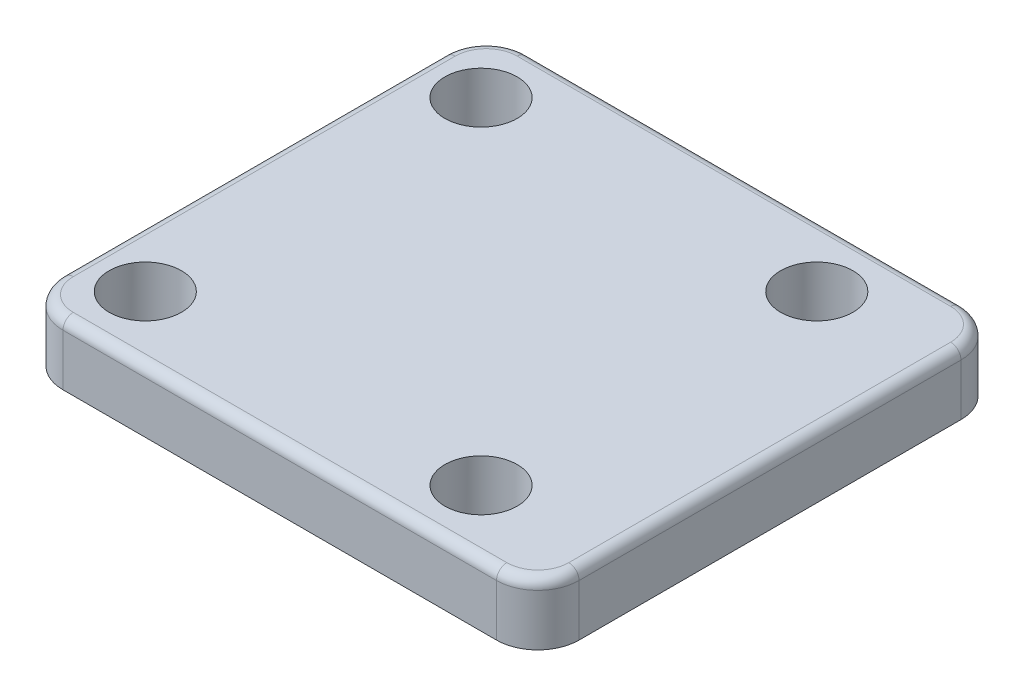
ISO-10303-21;
HEADER;
FILE_DESCRIPTION(('STEP AP214'),'2;1');
FILE_NAME('part.step','',(''),(''),'','','');
FILE_SCHEMA(('AUTOMOTIVE_DESIGN { 1 0 10303 214 1 1 1 1 }'));
ENDSEC;
DATA;
#1=APPLICATION_CONTEXT('core data for automotive mechanical design processes');
#2=APPLICATION_PROTOCOL_DEFINITION('international standard','automotive_design',2000,#1);
#3=PRODUCT_CONTEXT('',#1,'mechanical');
#4=PRODUCT('Part','Part','',(#3));
#5=PRODUCT_RELATED_PRODUCT_CATEGORY('part','',(#4));
#6=PRODUCT_DEFINITION_FORMATION('','',#4);
#7=PRODUCT_DEFINITION_CONTEXT('part definition',#1,'design');
#8=PRODUCT_DEFINITION('design','',#6,#7);
#9=PRODUCT_DEFINITION_SHAPE('','',#8);
#10=(LENGTH_UNIT() NAMED_UNIT(*) SI_UNIT(.MILLI.,.METRE.));
#11=(NAMED_UNIT(*) PLANE_ANGLE_UNIT() SI_UNIT($,.RADIAN.));
#12=(NAMED_UNIT(*) SI_UNIT($,.STERADIAN.) SOLID_ANGLE_UNIT());
#13=UNCERTAINTY_MEASURE_WITH_UNIT(LENGTH_MEASURE(1.E-05),#10,'distance_accuracy_value','');
#14=(GEOMETRIC_REPRESENTATION_CONTEXT(3) GLOBAL_UNCERTAINTY_ASSIGNED_CONTEXT((#13)) GLOBAL_UNIT_ASSIGNED_CONTEXT((#10,
#11,#12)) REPRESENTATION_CONTEXT('',''));
#15=CARTESIAN_POINT('',(0.,0.,0.));
#16=DIRECTION('',(0.,0.,1.));
#17=DIRECTION('',(1.,0.,0.));
#18=AXIS2_PLACEMENT_3D('',#15,#16,#17);
#19=CARTESIAN_POINT('',(24.,6.,-18.5));
#20=DIRECTION('',(0.,-1.,0.));
#21=DIRECTION('',(0.,0.,-1.));
#22=AXIS2_PLACEMENT_3D('',#19,#20,#21);
#23=CYLINDRICAL_SURFACE('',#22,4.);
#24=DIRECTION('',(0.,-1.,0.));
#25=VECTOR('',#24,1.);
#26=CARTESIAN_POINT('',(24.,6.,-22.5));
#27=LINE('',#26,#25);
#28=CARTESIAN_POINT('',(24.,5.,-22.5));
#29=VERTEX_POINT('',#28);
#30=CARTESIAN_POINT('',(24.,0.,-22.5));
#31=VERTEX_POINT('',#30);
#32=EDGE_CURVE('E124',#29,#31,#27,.T.);
#33=ORIENTED_EDGE('',*,*,#32,.F.);
#34=CARTESIAN_POINT('',(24.,5.,-18.5));
#35=DIRECTION('',(0.,-1.,0.));
#36=DIRECTION('',(0.,0.,-1.));
#37=AXIS2_PLACEMENT_3D('',#34,#35,#36);
#38=CIRCLE('',#37,4.);
#39=CARTESIAN_POINT('',(28.,5.,-18.5));
#40=VERTEX_POINT('',#39);
#41=EDGE_CURVE('E212',#29,#40,#38,.T.);
#42=ORIENTED_EDGE('',*,*,#41,.T.);
#43=DIRECTION('',(0.,-1.,0.));
#44=VECTOR('',#43,1.);
#45=CARTESIAN_POINT('',(28.,6.,-18.5));
#46=LINE('',#45,#44);
#47=CARTESIAN_POINT('',(28.,0.,-18.5));
#48=VERTEX_POINT('',#47);
#49=EDGE_CURVE('E145',#40,#48,#46,.T.);
#50=ORIENTED_EDGE('',*,*,#49,.T.);
#51=CARTESIAN_POINT('',(24.,0.,-18.5));
#52=DIRECTION('',(0.,1.,0.));
#53=DIRECTION('',(0.,0.,-1.));
#54=AXIS2_PLACEMENT_3D('',#51,#52,#53);
#55=CIRCLE('',#54,4.);
#56=EDGE_CURVE('E139',#48,#31,#55,.T.);
#57=ORIENTED_EDGE('',*,*,#56,.T.);
#58=EDGE_LOOP('',(#33,#42,#50,#57));
#59=FACE_BOUND('',#58,.T.);
#60=ADVANCED_FACE('F35',(#59),#23,.T.);
#61=CARTESIAN_POINT('',(-18.,6.,-22.5));
#62=DIRECTION('',(0.,0.,1.));
#63=DIRECTION('',(1.,0.,0.));
#64=AXIS2_PLACEMENT_3D('',#61,#62,#63);
#65=PLANE('',#64);
#66=DIRECTION('',(0.,-1.,0.));
#67=VECTOR('',#66,1.);
#68=CARTESIAN_POINT('',(-18.,6.,-22.5));
#69=LINE('',#68,#67);
#70=CARTESIAN_POINT('',(-18.,5.,-22.5));
#71=VERTEX_POINT('',#70);
#72=CARTESIAN_POINT('',(-18.,0.,-22.5));
#73=VERTEX_POINT('',#72);
#74=EDGE_CURVE('E133',#71,#73,#69,.T.);
#75=ORIENTED_EDGE('',*,*,#74,.F.);
#76=DIRECTION('',(-1.,0.,0.));
#77=VECTOR('',#76,1.);
#78=CARTESIAN_POINT('',(-18.,5.,-22.5));
#79=LINE('',#78,#77);
#80=EDGE_CURVE('E51',#71,#29,#79,.F.);
#81=ORIENTED_EDGE('',*,*,#80,.T.);
#82=ORIENTED_EDGE('',*,*,#32,.T.);
#83=DIRECTION('',(-1.,0.,0.));
#84=VECTOR('',#83,1.);
#85=CARTESIAN_POINT('',(-18.,0.,-22.5));
#86=LINE('',#85,#84);
#87=EDGE_CURVE('E127',#31,#73,#86,.T.);
#88=ORIENTED_EDGE('',*,*,#87,.T.);
#89=EDGE_LOOP('',(#75,#81,#82,#88));
#90=FACE_BOUND('',#89,.T.);
#91=ADVANCED_FACE('F126',(#90),#65,.F.);
#92=CARTESIAN_POINT('',(-18.,6.,-18.5));
#93=DIRECTION('',(0.,-1.,0.));
#94=DIRECTION('',(0.,0.,-1.));
#95=AXIS2_PLACEMENT_3D('',#92,#93,#94);
#96=CYLINDRICAL_SURFACE('',#95,4.);
#97=DIRECTION('',(0.,-1.,0.));
#98=VECTOR('',#97,1.);
#99=CARTESIAN_POINT('',(-22.,6.,-18.5));
#100=LINE('',#99,#98);
#101=CARTESIAN_POINT('',(-22.,5.,-18.5));
#102=VERTEX_POINT('',#101);
#103=CARTESIAN_POINT('',(-22.,0.,-18.5));
#104=VERTEX_POINT('',#103);
#105=EDGE_CURVE('E180',#102,#104,#100,.T.);
#106=ORIENTED_EDGE('',*,*,#105,.F.);
#107=CARTESIAN_POINT('',(-18.,5.,-18.5));
#108=DIRECTION('',(0.,-1.,0.));
#109=DIRECTION('',(0.,0.,-1.));
#110=AXIS2_PLACEMENT_3D('',#107,#108,#109);
#111=CIRCLE('',#110,4.);
#112=EDGE_CURVE('E59',#102,#71,#111,.T.);
#113=ORIENTED_EDGE('',*,*,#112,.T.);
#114=ORIENTED_EDGE('',*,*,#74,.T.);
#115=CARTESIAN_POINT('',(-18.,0.,-18.5));
#116=DIRECTION('',(0.,1.,0.));
#117=DIRECTION('',(0.,0.,1.));
#118=AXIS2_PLACEMENT_3D('',#115,#116,#117);
#119=CIRCLE('',#118,4.);
#120=EDGE_CURVE('E142',#73,#104,#119,.T.);
#121=ORIENTED_EDGE('',*,*,#120,.T.);
#122=EDGE_LOOP('',(#106,#113,#114,#121));
#123=FACE_BOUND('',#122,.T.);
#124=ADVANCED_FACE('F274',(#123),#96,.T.);
#125=CARTESIAN_POINT('',(-22.,6.,-18.5));
#126=DIRECTION('',(1.,0.,0.));
#127=DIRECTION('',(0.,0.,-1.));
#128=AXIS2_PLACEMENT_3D('',#125,#126,#127);
#129=PLANE('',#128);
#130=DIRECTION('',(0.,-1.,0.));
#131=VECTOR('',#130,1.);
#132=CARTESIAN_POINT('',(-22.,6.,18.5));
#133=LINE('',#132,#131);
#134=CARTESIAN_POINT('',(-22.,5.,18.5));
#135=VERTEX_POINT('',#134);
#136=CARTESIAN_POINT('',(-22.,0.,18.5));
#137=VERTEX_POINT('',#136);
#138=EDGE_CURVE('E178',#135,#137,#133,.T.);
#139=ORIENTED_EDGE('',*,*,#138,.F.);
#140=DIRECTION('',(0.,0.,1.));
#141=VECTOR('',#140,1.);
#142=CARTESIAN_POINT('',(-22.,5.,-18.5));
#143=LINE('',#142,#141);
#144=EDGE_CURVE('E208',#135,#102,#143,.F.);
#145=ORIENTED_EDGE('',*,*,#144,.T.);
#146=ORIENTED_EDGE('',*,*,#105,.T.);
#147=DIRECTION('',(0.,0.,1.));
#148=VECTOR('',#147,1.);
#149=CARTESIAN_POINT('',(-22.,0.,-18.5));
#150=LINE('',#149,#148);
#151=EDGE_CURVE('E157',#104,#137,#150,.T.);
#152=ORIENTED_EDGE('',*,*,#151,.T.);
#153=EDGE_LOOP('',(#139,#145,#146,#152));
#154=FACE_BOUND('',#153,.T.);
#155=ADVANCED_FACE('F315',(#154),#129,.F.);
#156=CARTESIAN_POINT('',(-18.,6.,18.5));
#157=DIRECTION('',(0.,-1.,0.));
#158=DIRECTION('',(0.,0.,-1.));
#159=AXIS2_PLACEMENT_3D('',#156,#157,#158);
#160=CYLINDRICAL_SURFACE('',#159,4.);
#161=DIRECTION('',(0.,-1.,0.));
#162=VECTOR('',#161,1.);
#163=CARTESIAN_POINT('',(-18.,6.,22.5));
#164=LINE('',#163,#162);
#165=CARTESIAN_POINT('',(-18.,5.,22.5));
#166=VERTEX_POINT('',#165);
#167=CARTESIAN_POINT('',(-18.,0.,22.5));
#168=VERTEX_POINT('',#167);
#169=EDGE_CURVE('E176',#166,#168,#164,.T.);
#170=ORIENTED_EDGE('',*,*,#169,.F.);
#171=CARTESIAN_POINT('',(-18.,5.,18.5));
#172=DIRECTION('',(0.,-1.,0.));
#173=DIRECTION('',(0.,0.,-1.));
#174=AXIS2_PLACEMENT_3D('',#171,#172,#173);
#175=CIRCLE('',#174,4.);
#176=EDGE_CURVE('E206',#166,#135,#175,.T.);
#177=ORIENTED_EDGE('',*,*,#176,.T.);
#178=ORIENTED_EDGE('',*,*,#138,.T.);
#179=CARTESIAN_POINT('',(-18.,0.,18.5));
#180=DIRECTION('',(0.,1.,0.));
#181=DIRECTION('',(0.,0.,1.));
#182=AXIS2_PLACEMENT_3D('',#179,#180,#181);
#183=CIRCLE('',#182,4.);
#184=EDGE_CURVE('E160',#137,#168,#183,.T.);
#185=ORIENTED_EDGE('',*,*,#184,.T.);
#186=EDGE_LOOP('',(#170,#177,#178,#185));
#187=FACE_BOUND('',#186,.T.);
#188=ADVANCED_FACE('F321',(#187),#160,.T.);
#189=CARTESIAN_POINT('',(-18.,6.,22.5));
#190=DIRECTION('',(0.,0.,-1.));
#191=DIRECTION('',(-1.,0.,0.));
#192=AXIS2_PLACEMENT_3D('',#189,#190,#191);
#193=PLANE('',#192);
#194=DIRECTION('',(0.,-1.,0.));
#195=VECTOR('',#194,1.);
#196=CARTESIAN_POINT('',(24.,6.,22.5));
#197=LINE('',#196,#195);
#198=CARTESIAN_POINT('',(24.,5.,22.5));
#199=VERTEX_POINT('',#198);
#200=CARTESIAN_POINT('',(24.,0.,22.5));
#201=VERTEX_POINT('',#200);
#202=EDGE_CURVE('E174',#199,#201,#197,.T.);
#203=ORIENTED_EDGE('',*,*,#202,.F.);
#204=DIRECTION('',(1.,0.,0.));
#205=VECTOR('',#204,1.);
#206=CARTESIAN_POINT('',(-18.,5.,22.5));
#207=LINE('',#206,#205);
#208=EDGE_CURVE('E204',#199,#166,#207,.F.);
#209=ORIENTED_EDGE('',*,*,#208,.T.);
#210=ORIENTED_EDGE('',*,*,#169,.T.);
#211=DIRECTION('',(1.,0.,0.));
#212=VECTOR('',#211,1.);
#213=CARTESIAN_POINT('',(-18.,0.,22.5));
#214=LINE('',#213,#212);
#215=EDGE_CURVE('E163',#168,#201,#214,.T.);
#216=ORIENTED_EDGE('',*,*,#215,.T.);
#217=EDGE_LOOP('',(#203,#209,#210,#216));
#218=FACE_BOUND('',#217,.T.);
#219=ADVANCED_FACE('F324',(#218),#193,.F.);
#220=CARTESIAN_POINT('',(24.,6.,18.5));
#221=DIRECTION('',(0.,-1.,0.));
#222=DIRECTION('',(0.,0.,-1.));
#223=AXIS2_PLACEMENT_3D('',#220,#221,#222);
#224=CYLINDRICAL_SURFACE('',#223,4.);
#225=DIRECTION('',(0.,-1.,0.));
#226=VECTOR('',#225,1.);
#227=CARTESIAN_POINT('',(28.,6.,18.5));
#228=LINE('',#227,#226);
#229=CARTESIAN_POINT('',(28.,5.,18.5));
#230=VERTEX_POINT('',#229);
#231=CARTESIAN_POINT('',(28.,0.,18.5));
#232=VERTEX_POINT('',#231);
#233=EDGE_CURVE('E172',#230,#232,#228,.T.);
#234=ORIENTED_EDGE('',*,*,#233,.F.);
#235=CARTESIAN_POINT('',(24.,5.,18.5));
#236=DIRECTION('',(0.,-1.,0.));
#237=DIRECTION('',(0.,0.,-1.));
#238=AXIS2_PLACEMENT_3D('',#235,#236,#237);
#239=CIRCLE('',#238,4.);
#240=EDGE_CURVE('E202',#230,#199,#239,.T.);
#241=ORIENTED_EDGE('',*,*,#240,.T.);
#242=ORIENTED_EDGE('',*,*,#202,.T.);
#243=CARTESIAN_POINT('',(24.,0.,18.5));
#244=DIRECTION('',(0.,1.,0.));
#245=DIRECTION('',(0.,0.,1.));
#246=AXIS2_PLACEMENT_3D('',#243,#244,#245);
#247=CIRCLE('',#246,4.);
#248=EDGE_CURVE('E166',#201,#232,#247,.T.);
#249=ORIENTED_EDGE('',*,*,#248,.T.);
#250=EDGE_LOOP('',(#234,#241,#242,#249));
#251=FACE_BOUND('',#250,.T.);
#252=ADVANCED_FACE('F343',(#251),#224,.T.);
#253=CARTESIAN_POINT('',(28.,6.,-18.5));
#254=DIRECTION('',(-1.,0.,0.));
#255=DIRECTION('',(0.,0.,1.));
#256=AXIS2_PLACEMENT_3D('',#253,#254,#255);
#257=PLANE('',#256);
#258=ORIENTED_EDGE('',*,*,#49,.F.);
#259=DIRECTION('',(0.,0.,-1.));
#260=VECTOR('',#259,1.);
#261=CARTESIAN_POINT('',(28.,5.,-18.5));
#262=LINE('',#261,#260);
#263=EDGE_CURVE('E199',#40,#230,#262,.F.);
#264=ORIENTED_EDGE('',*,*,#263,.T.);
#265=ORIENTED_EDGE('',*,*,#233,.T.);
#266=DIRECTION('',(0.,0.,-1.));
#267=VECTOR('',#266,1.);
#268=CARTESIAN_POINT('',(28.,0.,-18.5));
#269=LINE('',#268,#267);
#270=EDGE_CURVE('E169',#232,#48,#269,.T.);
#271=ORIENTED_EDGE('',*,*,#270,.T.);
#272=EDGE_LOOP('',(#258,#264,#265,#271));
#273=FACE_BOUND('',#272,.T.);
#274=ADVANCED_FACE('F263',(#273),#257,.F.);
#275=CARTESIAN_POINT('',(24.,6.,-18.5));
#276=DIRECTION('',(0.,-1.,0.));
#277=DIRECTION('',(0.,0.,-1.));
#278=AXIS2_PLACEMENT_3D('',#275,#276,#277);
#279=PLANE('',#278);
#280=CARTESIAN_POINT('',(-16.2634559672896,6.,16.2634559672907));
#281=DIRECTION('',(0.,1.,0.));
#282=DIRECTION('',(0.,0.,1.));
#283=AXIS2_PLACEMENT_3D('',#280,#281,#282);
#284=CIRCLE('',#283,3.50000000000048);
#285=CARTESIAN_POINT('',(-16.2634559672896,6.,19.7634559672912));
#286=VERTEX_POINT('',#285);
#287=EDGE_CURVE('E513',#286,#286,#284,.T.);
#288=ORIENTED_EDGE('',*,*,#287,.F.);
#289=EDGE_LOOP('',(#288));
#290=FACE_BOUND('',#289,.T.);
#291=CARTESIAN_POINT('',(16.2634559672916,6.,16.2634559672896));
#292=DIRECTION('',(0.,1.,0.));
#293=DIRECTION('',(0.,0.,1.));
#294=AXIS2_PLACEMENT_3D('',#291,#292,#293);
#295=CIRCLE('',#294,3.50000000000129);
#296=CARTESIAN_POINT('',(16.2634559672916,6.,19.7634559672909));
#297=VERTEX_POINT('',#296);
#298=EDGE_CURVE('E514',#297,#297,#295,.T.);
#299=ORIENTED_EDGE('',*,*,#298,.F.);
#300=EDGE_LOOP('',(#299));
#301=FACE_BOUND('',#300,.T.);
#302=CARTESIAN_POINT('',(16.2634559672905,6.,-16.2634559672916));
#303=DIRECTION('',(0.,1.,0.));
#304=DIRECTION('',(0.,0.,1.));
#305=AXIS2_PLACEMENT_3D('',#302,#303,#304);
#306=CIRCLE('',#305,3.50000000000094);
#307=CARTESIAN_POINT('',(16.2634559672905,6.,-12.7634559672907));
#308=VERTEX_POINT('',#307);
#309=EDGE_CURVE('E517',#308,#308,#306,.T.);
#310=ORIENTED_EDGE('',*,*,#309,.F.);
#311=EDGE_LOOP('',(#310));
#312=FACE_BOUND('',#311,.T.);
#313=CARTESIAN_POINT('',(-16.2634559672907,6.,-16.2634559672905));
#314=DIRECTION('',(0.,1.,0.));
#315=DIRECTION('',(0.,0.,1.));
#316=AXIS2_PLACEMENT_3D('',#313,#314,#315);
#317=CIRCLE('',#316,3.5);
#318=CARTESIAN_POINT('',(-16.2634559672907,6.,-12.7634559672905));
#319=VERTEX_POINT('',#318);
#320=EDGE_CURVE('E237',#319,#319,#317,.T.);
#321=ORIENTED_EDGE('',*,*,#320,.F.);
#322=EDGE_LOOP('',(#321));
#323=FACE_BOUND('',#322,.T.);
#324=CARTESIAN_POINT('',(24.,6.,18.5));
#325=DIRECTION('',(0.,-1.,0.));
#326=DIRECTION('',(0.,0.,-1.));
#327=AXIS2_PLACEMENT_3D('',#324,#325,#326);
#328=CIRCLE('',#327,3.);
#329=CARTESIAN_POINT('',(24.,6.,21.5));
#330=VERTEX_POINT('',#329);
#331=CARTESIAN_POINT('',(27.,6.,18.5));
#332=VERTEX_POINT('',#331);
#333=EDGE_CURVE('E194',#330,#332,#328,.F.);
#334=ORIENTED_EDGE('',*,*,#333,.T.);
#335=DIRECTION('',(0.,0.,-1.));
#336=VECTOR('',#335,1.);
#337=CARTESIAN_POINT('',(27.,6.,-18.5));
#338=LINE('',#337,#336);
#339=CARTESIAN_POINT('',(27.,6.,-18.5));
#340=VERTEX_POINT('',#339);
#341=EDGE_CURVE('E196',#332,#340,#338,.T.);
#342=ORIENTED_EDGE('',*,*,#341,.T.);
#343=CARTESIAN_POINT('',(24.,6.,-18.5));
#344=DIRECTION('',(0.,-1.,0.));
#345=DIRECTION('',(0.,0.,-1.));
#346=AXIS2_PLACEMENT_3D('',#343,#344,#345);
#347=CIRCLE('',#346,3.);
#348=CARTESIAN_POINT('',(24.,6.,-21.5));
#349=VERTEX_POINT('',#348);
#350=EDGE_CURVE('E132',#340,#349,#347,.F.);
#351=ORIENTED_EDGE('',*,*,#350,.T.);
#352=DIRECTION('',(-1.,0.,0.));
#353=VECTOR('',#352,1.);
#354=CARTESIAN_POINT('',(24.,6.,-21.5));
#355=LINE('',#354,#353);
#356=CARTESIAN_POINT('',(-18.,6.,-21.5));
#357=VERTEX_POINT('',#356);
#358=EDGE_CURVE('E184',#349,#357,#355,.T.);
#359=ORIENTED_EDGE('',*,*,#358,.T.);
#360=CARTESIAN_POINT('',(-18.,6.,-18.5));
#361=DIRECTION('',(0.,-1.,0.));
#362=DIRECTION('',(0.,0.,-1.));
#363=AXIS2_PLACEMENT_3D('',#360,#361,#362);
#364=CIRCLE('',#363,3.);
#365=CARTESIAN_POINT('',(-21.,6.,-18.5));
#366=VERTEX_POINT('',#365);
#367=EDGE_CURVE('E186',#357,#366,#364,.F.);
#368=ORIENTED_EDGE('',*,*,#367,.T.);
#369=DIRECTION('',(0.,0.,1.));
#370=VECTOR('',#369,1.);
#371=CARTESIAN_POINT('',(-21.,6.,-18.5));
#372=LINE('',#371,#370);
#373=CARTESIAN_POINT('',(-21.,6.,18.5));
#374=VERTEX_POINT('',#373);
#375=EDGE_CURVE('E188',#366,#374,#372,.T.);
#376=ORIENTED_EDGE('',*,*,#375,.T.);
#377=CARTESIAN_POINT('',(-18.,6.,18.5));
#378=DIRECTION('',(0.,-1.,0.));
#379=DIRECTION('',(0.,0.,-1.));
#380=AXIS2_PLACEMENT_3D('',#377,#378,#379);
#381=CIRCLE('',#380,3.);
#382=CARTESIAN_POINT('',(-18.,6.,21.5));
#383=VERTEX_POINT('',#382);
#384=EDGE_CURVE('E190',#374,#383,#381,.F.);
#385=ORIENTED_EDGE('',*,*,#384,.T.);
#386=DIRECTION('',(1.,0.,0.));
#387=VECTOR('',#386,1.);
#388=CARTESIAN_POINT('',(24.,6.,21.5));
#389=LINE('',#388,#387);
#390=EDGE_CURVE('E192',#383,#330,#389,.T.);
#391=ORIENTED_EDGE('',*,*,#390,.T.);
#392=EDGE_LOOP('',(#334,#342,#351,#359,#368,#376,#385,#391));
#393=FACE_BOUND('',#392,.T.);
#394=ADVANCED_FACE('F254',(#290,#301,#312,#323,#393),#279,.F.);
#395=CARTESIAN_POINT('',(24.,0.,-18.5));
#396=DIRECTION('',(0.,-1.,0.));
#397=DIRECTION('',(0.,0.,-1.));
#398=AXIS2_PLACEMENT_3D('',#395,#396,#397);
#399=PLANE('',#398);
#400=CARTESIAN_POINT('',(-16.2634559672896,0.,16.2634559672907));
#401=DIRECTION('',(0.,-1.,0.));
#402=DIRECTION('',(0.,0.,-1.));
#403=AXIS2_PLACEMENT_3D('',#400,#401,#402);
#404=CIRCLE('',#403,3.50000000000048);
#405=CARTESIAN_POINT('',(-16.2634559672896,0.,12.7634559672902));
#406=VERTEX_POINT('',#405);
#407=EDGE_CURVE('E217',#406,#406,#404,.T.);
#408=ORIENTED_EDGE('',*,*,#407,.F.);
#409=EDGE_LOOP('',(#408));
#410=FACE_BOUND('',#409,.T.);
#411=CARTESIAN_POINT('',(16.2634559672916,0.,16.2634559672896));
#412=DIRECTION('',(0.,-1.,0.));
#413=DIRECTION('',(0.,0.,-1.));
#414=AXIS2_PLACEMENT_3D('',#411,#412,#413);
#415=CIRCLE('',#414,3.50000000000129);
#416=CARTESIAN_POINT('',(16.2634559672916,0.,12.7634559672883));
#417=VERTEX_POINT('',#416);
#418=EDGE_CURVE('E240',#417,#417,#415,.T.);
#419=ORIENTED_EDGE('',*,*,#418,.F.);
#420=EDGE_LOOP('',(#419));
#421=FACE_BOUND('',#420,.T.);
#422=CARTESIAN_POINT('',(16.2634559672905,0.,-16.2634559672916));
#423=DIRECTION('',(0.,-1.,0.));
#424=DIRECTION('',(0.,0.,-1.));
#425=AXIS2_PLACEMENT_3D('',#422,#423,#424);
#426=CIRCLE('',#425,3.50000000000094);
#427=CARTESIAN_POINT('',(16.2634559672905,0.,-19.7634559672925));
#428=VERTEX_POINT('',#427);
#429=EDGE_CURVE('E236',#428,#428,#426,.T.);
#430=ORIENTED_EDGE('',*,*,#429,.F.);
#431=EDGE_LOOP('',(#430));
#432=FACE_BOUND('',#431,.T.);
#433=CARTESIAN_POINT('',(-16.2634559672907,0.,-16.2634559672905));
#434=DIRECTION('',(0.,-1.,0.));
#435=DIRECTION('',(0.,0.,-1.));
#436=AXIS2_PLACEMENT_3D('',#433,#434,#435);
#437=CIRCLE('',#436,3.5);
#438=CARTESIAN_POINT('',(-16.2634559672907,0.,-19.7634559672905));
#439=VERTEX_POINT('',#438);
#440=EDGE_CURVE('E233',#439,#439,#437,.T.);
#441=ORIENTED_EDGE('',*,*,#440,.F.);
#442=EDGE_LOOP('',(#441));
#443=FACE_BOUND('',#442,.T.);
#444=CARTESIAN_POINT('',(0.,0.,0.));
#445=DIRECTION('',(0.,-1.,0.));
#446=DIRECTION('',(0.,0.,-1.));
#447=AXIS2_PLACEMENT_3D('',#444,#445,#446);
#448=CIRCLE('',#447,16.);
#449=CARTESIAN_POINT('',(0.,0.,-16.));
#450=VERTEX_POINT('',#449);
#451=EDGE_CURVE('E153',#450,#450,#448,.T.);
#452=ORIENTED_EDGE('',*,*,#451,.F.);
#453=EDGE_LOOP('',(#452));
#454=FACE_BOUND('',#453,.T.);
#455=ORIENTED_EDGE('',*,*,#56,.F.);
#456=ORIENTED_EDGE('',*,*,#270,.F.);
#457=ORIENTED_EDGE('',*,*,#248,.F.);
#458=ORIENTED_EDGE('',*,*,#215,.F.);
#459=ORIENTED_EDGE('',*,*,#184,.F.);
#460=ORIENTED_EDGE('',*,*,#151,.F.);
#461=ORIENTED_EDGE('',*,*,#120,.F.);
#462=ORIENTED_EDGE('',*,*,#87,.F.);
#463=EDGE_LOOP('',(#455,#456,#457,#458,#459,#460,#461,#462));
#464=FACE_BOUND('',#463,.T.);
#465=ADVANCED_FACE('F137',(#410,#421,#432,#443,#454,#464),#399,.T.);
#466=CARTESIAN_POINT('',(-21.,5.,-18.5));
#467=DIRECTION('',(0.,0.,1.));
#468=DIRECTION('',(1.,0.,0.));
#469=AXIS2_PLACEMENT_3D('',#466,#467,#468);
#470=CYLINDRICAL_SURFACE('',#469,1.);
#471=CARTESIAN_POINT('',(-21.,5.,-18.5));
#472=DIRECTION('',(0.,0.,-1.));
#473=DIRECTION('',(-1.,0.,0.));
#474=AXIS2_PLACEMENT_3D('',#471,#472,#473);
#475=CIRCLE('',#474,1.);
#476=EDGE_CURVE('E150',#102,#366,#475,.T.);
#477=ORIENTED_EDGE('',*,*,#476,.F.);
#478=ORIENTED_EDGE('',*,*,#144,.F.);
#479=CARTESIAN_POINT('',(-21.,5.,18.5));
#480=DIRECTION('',(0.,0.,1.));
#481=DIRECTION('',(1.,0.,0.));
#482=AXIS2_PLACEMENT_3D('',#479,#480,#481);
#483=CIRCLE('',#482,1.);
#484=EDGE_CURVE('E147',#374,#135,#483,.T.);
#485=ORIENTED_EDGE('',*,*,#484,.F.);
#486=ORIENTED_EDGE('',*,*,#375,.F.);
#487=EDGE_LOOP('',(#477,#478,#485,#486));
#488=FACE_BOUND('',#487,.T.);
#489=ADVANCED_FACE('F253',(#488),#470,.T.);
#490=CARTESIAN_POINT('',(-18.,5.,18.5));
#491=DIRECTION('',(0.,-1.,0.));
#492=DIRECTION('',(0.,0.,-1.));
#493=AXIS2_PLACEMENT_3D('',#490,#491,#492);
#494=TOROIDAL_SURFACE('',#493,3.,1.);
#495=ORIENTED_EDGE('',*,*,#484,.T.);
#496=ORIENTED_EDGE('',*,*,#176,.F.);
#497=CARTESIAN_POINT('',(-18.,5.,21.5));
#498=DIRECTION('',(1.,0.,0.));
#499=DIRECTION('',(0.,0.,-1.));
#500=AXIS2_PLACEMENT_3D('',#497,#498,#499);
#501=CIRCLE('',#500,1.);
#502=EDGE_CURVE('E228',#383,#166,#501,.T.);
#503=ORIENTED_EDGE('',*,*,#502,.F.);
#504=ORIENTED_EDGE('',*,*,#384,.F.);
#505=EDGE_LOOP('',(#495,#496,#503,#504));
#506=FACE_BOUND('',#505,.T.);
#507=ADVANCED_FACE('F261',(#506),#494,.T.);
#508=CARTESIAN_POINT('',(-18.,5.,-18.5));
#509=DIRECTION('',(0.,-1.,0.));
#510=DIRECTION('',(0.,0.,-1.));
#511=AXIS2_PLACEMENT_3D('',#508,#509,#510);
#512=TOROIDAL_SURFACE('',#511,3.,1.);
#513=ORIENTED_EDGE('',*,*,#476,.T.);
#514=ORIENTED_EDGE('',*,*,#367,.F.);
#515=CARTESIAN_POINT('',(-18.,5.,-21.5));
#516=DIRECTION('',(1.,0.,0.));
#517=DIRECTION('',(0.,0.,-1.));
#518=AXIS2_PLACEMENT_3D('',#515,#516,#517);
#519=CIRCLE('',#518,1.);
#520=EDGE_CURVE('E225',#71,#357,#519,.T.);
#521=ORIENTED_EDGE('',*,*,#520,.F.);
#522=ORIENTED_EDGE('',*,*,#112,.F.);
#523=EDGE_LOOP('',(#513,#514,#521,#522));
#524=FACE_BOUND('',#523,.T.);
#525=ADVANCED_FACE('F297',(#524),#512,.T.);
#526=CARTESIAN_POINT('',(24.,5.,21.5));
#527=DIRECTION('',(1.,0.,0.));
#528=DIRECTION('',(0.,0.,-1.));
#529=AXIS2_PLACEMENT_3D('',#526,#527,#528);
#530=CYLINDRICAL_SURFACE('',#529,1.);
#531=ORIENTED_EDGE('',*,*,#502,.T.);
#532=ORIENTED_EDGE('',*,*,#208,.F.);
#533=CARTESIAN_POINT('',(24.,5.,21.5));
#534=DIRECTION('',(1.,0.,0.));
#535=DIRECTION('',(0.,0.,-1.));
#536=AXIS2_PLACEMENT_3D('',#533,#534,#535);
#537=CIRCLE('',#536,1.);
#538=EDGE_CURVE('E222',#330,#199,#537,.T.);
#539=ORIENTED_EDGE('',*,*,#538,.F.);
#540=ORIENTED_EDGE('',*,*,#390,.F.);
#541=EDGE_LOOP('',(#531,#532,#539,#540));
#542=FACE_BOUND('',#541,.T.);
#543=ADVANCED_FACE('F293',(#542),#530,.T.);
#544=CARTESIAN_POINT('',(24.,5.,-21.5));
#545=DIRECTION('',(-1.,0.,0.));
#546=DIRECTION('',(0.,0.,1.));
#547=AXIS2_PLACEMENT_3D('',#544,#545,#546);
#548=CYLINDRICAL_SURFACE('',#547,1.);
#549=ORIENTED_EDGE('',*,*,#520,.T.);
#550=ORIENTED_EDGE('',*,*,#358,.F.);
#551=CARTESIAN_POINT('',(24.,5.,-21.5));
#552=DIRECTION('',(1.,0.,0.));
#553=DIRECTION('',(0.,0.,-1.));
#554=AXIS2_PLACEMENT_3D('',#551,#552,#553);
#555=CIRCLE('',#554,1.);
#556=EDGE_CURVE('E219',#29,#349,#555,.T.);
#557=ORIENTED_EDGE('',*,*,#556,.F.);
#558=ORIENTED_EDGE('',*,*,#80,.F.);
#559=EDGE_LOOP('',(#549,#550,#557,#558));
#560=FACE_BOUND('',#559,.T.);
#561=ADVANCED_FACE('F289',(#560),#548,.T.);
#562=CARTESIAN_POINT('',(24.,5.,18.5));
#563=DIRECTION('',(0.,-1.,0.));
#564=DIRECTION('',(0.,0.,-1.));
#565=AXIS2_PLACEMENT_3D('',#562,#563,#564);
#566=TOROIDAL_SURFACE('',#565,3.,1.);
#567=ORIENTED_EDGE('',*,*,#538,.T.);
#568=ORIENTED_EDGE('',*,*,#240,.F.);
#569=CARTESIAN_POINT('',(27.,5.,18.5));
#570=DIRECTION('',(0.,0.,-1.));
#571=DIRECTION('',(-1.,0.,0.));
#572=AXIS2_PLACEMENT_3D('',#569,#570,#571);
#573=CIRCLE('',#572,1.);
#574=EDGE_CURVE('E216',#332,#230,#573,.T.);
#575=ORIENTED_EDGE('',*,*,#574,.F.);
#576=ORIENTED_EDGE('',*,*,#333,.F.);
#577=EDGE_LOOP('',(#567,#568,#575,#576));
#578=FACE_BOUND('',#577,.T.);
#579=ADVANCED_FACE('F285',(#578),#566,.T.);
#580=CARTESIAN_POINT('',(24.,5.,-18.5));
#581=DIRECTION('',(0.,-1.,0.));
#582=DIRECTION('',(0.,0.,-1.));
#583=AXIS2_PLACEMENT_3D('',#580,#581,#582);
#584=TOROIDAL_SURFACE('',#583,3.,1.);
#585=ORIENTED_EDGE('',*,*,#556,.T.);
#586=ORIENTED_EDGE('',*,*,#350,.F.);
#587=CARTESIAN_POINT('',(27.,5.,-18.5));
#588=DIRECTION('',(0.,0.,1.));
#589=DIRECTION('',(0.,-1.,0.));
#590=AXIS2_PLACEMENT_3D('',#587,#588,#589);
#591=CIRCLE('',#590,1.);
#592=EDGE_CURVE('E214',#40,#340,#591,.T.);
#593=ORIENTED_EDGE('',*,*,#592,.F.);
#594=ORIENTED_EDGE('',*,*,#41,.F.);
#595=EDGE_LOOP('',(#585,#586,#593,#594));
#596=FACE_BOUND('',#595,.T.);
#597=ADVANCED_FACE('F281',(#596),#584,.T.);
#598=CARTESIAN_POINT('',(27.,5.,-18.5));
#599=DIRECTION('',(0.,0.,-1.));
#600=DIRECTION('',(-1.,0.,0.));
#601=AXIS2_PLACEMENT_3D('',#598,#599,#600);
#602=CYLINDRICAL_SURFACE('',#601,1.);
#603=ORIENTED_EDGE('',*,*,#574,.T.);
#604=ORIENTED_EDGE('',*,*,#263,.F.);
#605=ORIENTED_EDGE('',*,*,#592,.T.);
#606=ORIENTED_EDGE('',*,*,#341,.F.);
#607=EDGE_LOOP('',(#603,#604,#605,#606));
#608=FACE_BOUND('',#607,.T.);
#609=ADVANCED_FACE('F278',(#608),#602,.T.);
#610=CARTESIAN_POINT('',(0.,-2.,0.));
#611=DIRECTION('',(0.,1.,0.));
#612=DIRECTION('',(0.,0.,1.));
#613=AXIS2_PLACEMENT_3D('',#610,#611,#612);
#614=CYLINDRICAL_SURFACE('',#613,16.);
#615=CARTESIAN_POINT('',(0.,-0.999999999999987,0.));
#616=DIRECTION('',(0.,-1.,0.));
#617=DIRECTION('',(0.,0.,-1.));
#618=AXIS2_PLACEMENT_3D('',#615,#616,#617);
#619=CIRCLE('',#618,16.);
#620=CARTESIAN_POINT('',(0.,-0.999999999999987,-16.));
#621=VERTEX_POINT('',#620);
#622=EDGE_CURVE('E11',#621,#621,#619,.F.);
#623=ORIENTED_EDGE('',*,*,#622,.T.);
#624=EDGE_LOOP('',(#623));
#625=FACE_BOUND('',#624,.T.);
#626=ORIENTED_EDGE('',*,*,#451,.T.);
#627=EDGE_LOOP('',(#626));
#628=FACE_BOUND('',#627,.T.);
#629=ADVANCED_FACE('F250',(#625,#628),#614,.T.);
#630=CARTESIAN_POINT('',(0.,-2.,0.));
#631=DIRECTION('',(0.,-1.,0.));
#632=DIRECTION('',(0.,0.,-1.));
#633=AXIS2_PLACEMENT_3D('',#630,#631,#632);
#634=PLANE('',#633);
#635=CARTESIAN_POINT('',(0.,-2.,0.));
#636=DIRECTION('',(0.,-1.,0.));
#637=DIRECTION('',(0.,0.,-1.));
#638=AXIS2_PLACEMENT_3D('',#635,#636,#637);
#639=CIRCLE('',#638,14.2679491924311);
#640=CARTESIAN_POINT('',(0.,-2.,-14.2679491924311));
#641=VERTEX_POINT('',#640);
#642=EDGE_CURVE('E44',#641,#641,#639,.T.);
#643=ORIENTED_EDGE('',*,*,#642,.T.);
#644=EDGE_LOOP('',(#643));
#645=FACE_BOUND('',#644,.T.);
#646=ADVANCED_FACE('F451',(#645),#634,.T.);
#647=CARTESIAN_POINT('',(-16.2634559672907,-2.,-16.2634559672905));
#648=DIRECTION('',(0.,1.,0.));
#649=DIRECTION('',(0.,0.,1.));
#650=AXIS2_PLACEMENT_3D('',#647,#648,#649);
#651=CYLINDRICAL_SURFACE('',#650,3.5);
#652=ORIENTED_EDGE('',*,*,#440,.T.);
#653=EDGE_LOOP('',(#652));
#654=FACE_BOUND('',#653,.T.);
#655=ORIENTED_EDGE('',*,*,#320,.T.);
#656=EDGE_LOOP('',(#655));
#657=FACE_BOUND('',#656,.T.);
#658=ADVANCED_FACE('F445',(#654,#657),#651,.F.);
#659=CARTESIAN_POINT('',(16.2634559672905,-2.,-16.2634559672916));
#660=DIRECTION('',(0.,1.,0.));
#661=DIRECTION('',(0.,0.,1.));
#662=AXIS2_PLACEMENT_3D('',#659,#660,#661);
#663=CYLINDRICAL_SURFACE('',#662,3.50000000000094);
#664=ORIENTED_EDGE('',*,*,#429,.T.);
#665=EDGE_LOOP('',(#664));
#666=FACE_BOUND('',#665,.T.);
#667=ORIENTED_EDGE('',*,*,#309,.T.);
#668=EDGE_LOOP('',(#667));
#669=FACE_BOUND('',#668,.T.);
#670=ADVANCED_FACE('F450',(#666,#669),#663,.F.);
#671=CARTESIAN_POINT('',(16.2634559672916,-2.,16.2634559672896));
#672=DIRECTION('',(0.,1.,0.));
#673=DIRECTION('',(0.,0.,1.));
#674=AXIS2_PLACEMENT_3D('',#671,#672,#673);
#675=CYLINDRICAL_SURFACE('',#674,3.50000000000129);
#676=ORIENTED_EDGE('',*,*,#418,.T.);
#677=EDGE_LOOP('',(#676));
#678=FACE_BOUND('',#677,.T.);
#679=ORIENTED_EDGE('',*,*,#298,.T.);
#680=EDGE_LOOP('',(#679));
#681=FACE_BOUND('',#680,.T.);
#682=ADVANCED_FACE('F463',(#678,#681),#675,.F.);
#683=CARTESIAN_POINT('',(-16.2634559672896,-2.,16.2634559672907));
#684=DIRECTION('',(0.,1.,0.));
#685=DIRECTION('',(0.,0.,1.));
#686=AXIS2_PLACEMENT_3D('',#683,#684,#685);
#687=CYLINDRICAL_SURFACE('',#686,3.50000000000048);
#688=ORIENTED_EDGE('',*,*,#407,.T.);
#689=EDGE_LOOP('',(#688));
#690=FACE_BOUND('',#689,.T.);
#691=ORIENTED_EDGE('',*,*,#287,.T.);
#692=EDGE_LOOP('',(#691));
#693=FACE_BOUND('',#692,.T.);
#694=ADVANCED_FACE('F473',(#690,#693),#687,.F.);
#695=CARTESIAN_POINT('',(0.,-2.,0.));
#696=DIRECTION('',(0.,1.,0.));
#697=DIRECTION('',(0.,0.,1.));
#698=AXIS2_PLACEMENT_3D('',#695,#696,#697);
#699=CONICAL_SURFACE('',#698,14.2679491924311,1.0471975511966);
#700=ORIENTED_EDGE('',*,*,#622,.F.);
#701=EDGE_LOOP('',(#700));
#702=FACE_BOUND('',#701,.T.);
#703=ORIENTED_EDGE('',*,*,#642,.F.);
#704=EDGE_LOOP('',(#703));
#705=FACE_BOUND('',#704,.T.);
#706=ADVANCED_FACE('F38',(#702,#705),#699,.T.);
#707=CLOSED_SHELL('',(#60,#91,#124,#155,#188,#219,#252,#274,#394,#465,#489,#507,#525,#543,#561,
#579,#597,#609,#629,#646,#658,#670,#682,#694,#706));
#708=MANIFOLD_SOLID_BREP('B2',#707);
#709=ADVANCED_BREP_SHAPE_REPRESENTATION('',(#18,#708),#14);
#710=SHAPE_DEFINITION_REPRESENTATION(#9,#709);
ENDSEC;
END-ISO-10303-21;
